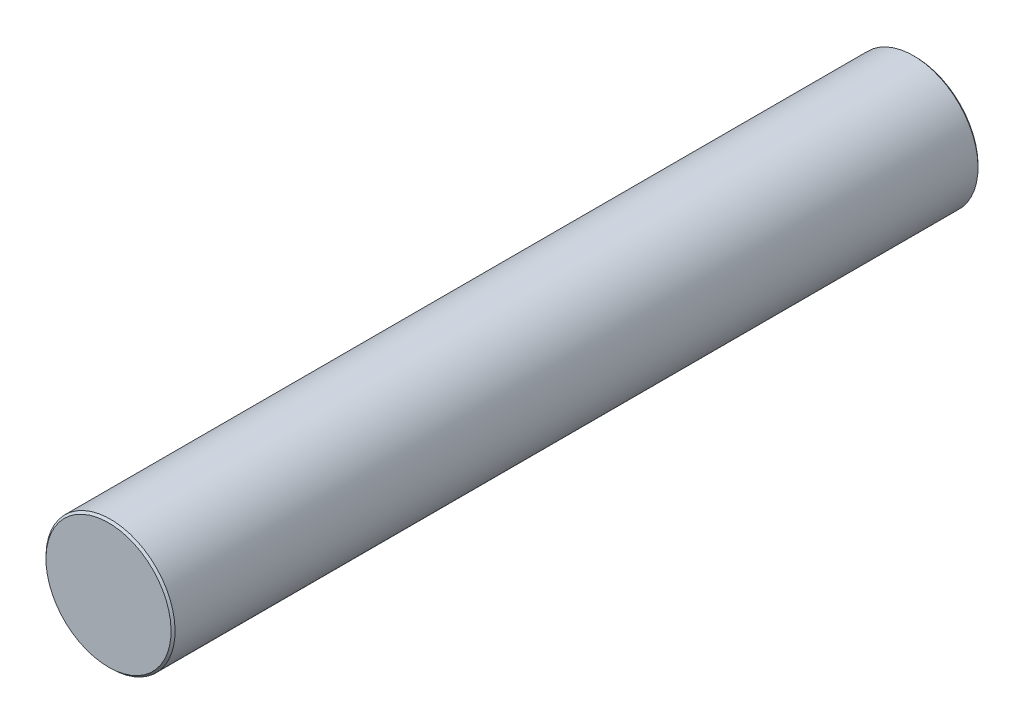
ISO-10303-21;
HEADER;
FILE_DESCRIPTION(('STEP AP214'),'2;1');
FILE_NAME('part.step','',(''),(''),'','','');
FILE_SCHEMA(('AUTOMOTIVE_DESIGN { 1 0 10303 214 1 1 1 1 }'));
ENDSEC;
DATA;
#1=APPLICATION_CONTEXT('core data for automotive mechanical design processes');
#2=APPLICATION_PROTOCOL_DEFINITION('international standard','automotive_design',2000,#1);
#3=PRODUCT_CONTEXT('',#1,'mechanical');
#4=PRODUCT('Part','Part','',(#3));
#5=PRODUCT_RELATED_PRODUCT_CATEGORY('part','',(#4));
#6=PRODUCT_DEFINITION_FORMATION('','',#4);
#7=PRODUCT_DEFINITION_CONTEXT('part definition',#1,'design');
#8=PRODUCT_DEFINITION('design','',#6,#7);
#9=PRODUCT_DEFINITION_SHAPE('','',#8);
#10=(LENGTH_UNIT() NAMED_UNIT(*) SI_UNIT(.MILLI.,.METRE.));
#11=(NAMED_UNIT(*) PLANE_ANGLE_UNIT() SI_UNIT($,.RADIAN.));
#12=(NAMED_UNIT(*) SI_UNIT($,.STERADIAN.) SOLID_ANGLE_UNIT());
#13=UNCERTAINTY_MEASURE_WITH_UNIT(LENGTH_MEASURE(1.E-05),#10,'distance_accuracy_value','');
#14=(GEOMETRIC_REPRESENTATION_CONTEXT(3) GLOBAL_UNCERTAINTY_ASSIGNED_CONTEXT((#13)) GLOBAL_UNIT_ASSIGNED_CONTEXT((#10,
#11,#12)) REPRESENTATION_CONTEXT('',''));
#15=CARTESIAN_POINT('',(0.,0.,0.));
#16=DIRECTION('',(0.,0.,1.));
#17=DIRECTION('',(1.,0.,0.));
#18=AXIS2_PLACEMENT_3D('',#15,#16,#17);
#19=CARTESIAN_POINT('',(0.,0.,0.));
#20=DIRECTION('',(0.,0.,1.));
#21=DIRECTION('',(1.,0.,0.));
#22=AXIS2_PLACEMENT_3D('',#19,#20,#21);
#23=PLANE('',#22);
#24=CARTESIAN_POINT('',(0.,0.,0.));
#25=DIRECTION('',(0.,0.,-1.));
#26=DIRECTION('',(0.,-1.,0.));
#27=AXIS2_PLACEMENT_3D('',#24,#25,#26);
#28=CIRCLE('',#27,3.87500000001);
#29=CARTESIAN_POINT('',(0.,-3.87500000001,0.));
#30=VERTEX_POINT('',#29);
#31=EDGE_CURVE('E11',#30,#30,#28,.T.);
#32=ORIENTED_EDGE('',*,*,#31,.T.);
#33=EDGE_LOOP('',(#32));
#34=FACE_BOUND('',#33,.T.);
#35=ADVANCED_FACE('F17',(#34),#23,.F.);
#36=CARTESIAN_POINT('',(0.,0.,50.));
#37=DIRECTION('',(0.,0.,1.));
#38=DIRECTION('',(1.,0.,0.));
#39=AXIS2_PLACEMENT_3D('',#36,#37,#38);
#40=PLANE('',#39);
#41=CARTESIAN_POINT('',(0.,0.,50.00000000001));
#42=DIRECTION('',(0.,0.,1.));
#43=DIRECTION('',(0.,-1.,0.));
#44=AXIS2_PLACEMENT_3D('',#41,#42,#43);
#45=CIRCLE('',#44,3.87500000001);
#46=CARTESIAN_POINT('',(0.,-3.87500000001,50.00000000001));
#47=VERTEX_POINT('',#46);
#48=EDGE_CURVE('E56',#47,#47,#45,.T.);
#49=ORIENTED_EDGE('',*,*,#48,.T.);
#50=EDGE_LOOP('',(#49));
#51=FACE_BOUND('',#50,.T.);
#52=ADVANCED_FACE('F19',(#51),#40,.T.);
#53=CARTESIAN_POINT('',(0.,0.,50.));
#54=DIRECTION('',(0.,0.,-1.));
#55=DIRECTION('',(0.,1.,0.));
#56=AXIS2_PLACEMENT_3D('',#53,#54,#55);
#57=CYLINDRICAL_SURFACE('',#56,4.);
#58=CARTESIAN_POINT('',(0.,0.,49.87500000001));
#59=DIRECTION('',(0.,0.,-1.));
#60=DIRECTION('',(0.,-1.,0.));
#61=AXIS2_PLACEMENT_3D('',#58,#59,#60);
#62=CIRCLE('',#61,4.00000000001);
#63=CARTESIAN_POINT('',(0.,-4.00000000001,49.87500000001));
#64=VERTEX_POINT('',#63);
#65=EDGE_CURVE('E52',#64,#64,#62,.T.);
#66=ORIENTED_EDGE('',*,*,#65,.T.);
#67=EDGE_LOOP('',(#66));
#68=FACE_BOUND('',#67,.T.);
#69=CARTESIAN_POINT('',(0.,0.,0.12500000001));
#70=DIRECTION('',(0.,0.,1.));
#71=DIRECTION('',(0.,-1.,0.));
#72=AXIS2_PLACEMENT_3D('',#69,#70,#71);
#73=CIRCLE('',#72,4.00000000001);
#74=CARTESIAN_POINT('',(0.,-4.00000000001,0.12500000001));
#75=VERTEX_POINT('',#74);
#76=EDGE_CURVE('E21',#75,#75,#73,.T.);
#77=ORIENTED_EDGE('',*,*,#76,.T.);
#78=EDGE_LOOP('',(#77));
#79=FACE_BOUND('',#78,.T.);
#80=ADVANCED_FACE('F53',(#68,#79),#57,.T.);
#81=CARTESIAN_POINT('',(0.,0.,0.125));
#82=DIRECTION('',(0.,0.,1.));
#83=DIRECTION('',(0.,-1.,0.));
#84=AXIS2_PLACEMENT_3D('',#81,#82,#83);
#85=CONICAL_SURFACE('',#84,4.,0.785398163397435);
#86=ORIENTED_EDGE('',*,*,#31,.F.);
#87=EDGE_LOOP('',(#86));
#88=FACE_BOUND('',#87,.T.);
#89=ORIENTED_EDGE('',*,*,#76,.F.);
#90=EDGE_LOOP('',(#89));
#91=FACE_BOUND('',#90,.T.);
#92=ADVANCED_FACE('F83',(#88,#91),#85,.T.);
#93=CARTESIAN_POINT('',(0.,0.,50.));
#94=DIRECTION('',(0.,0.,-1.));
#95=DIRECTION('',(0.,1.,0.));
#96=AXIS2_PLACEMENT_3D('',#93,#94,#95);
#97=CONICAL_SURFACE('',#96,3.875,0.785398163397462);
#98=ORIENTED_EDGE('',*,*,#48,.F.);
#99=EDGE_LOOP('',(#98));
#100=FACE_BOUND('',#99,.T.);
#101=ORIENTED_EDGE('',*,*,#65,.F.);
#102=EDGE_LOOP('',(#101));
#103=FACE_BOUND('',#102,.T.);
#104=ADVANCED_FACE('F78',(#100,#103),#97,.T.);
#105=CLOSED_SHELL('',(#35,#52,#80,#92,#104));
#106=MANIFOLD_SOLID_BREP('B1',#105);
#107=ADVANCED_BREP_SHAPE_REPRESENTATION('',(#18,#106),#14);
#108=SHAPE_DEFINITION_REPRESENTATION(#9,#107);
ENDSEC;
END-ISO-10303-21;
